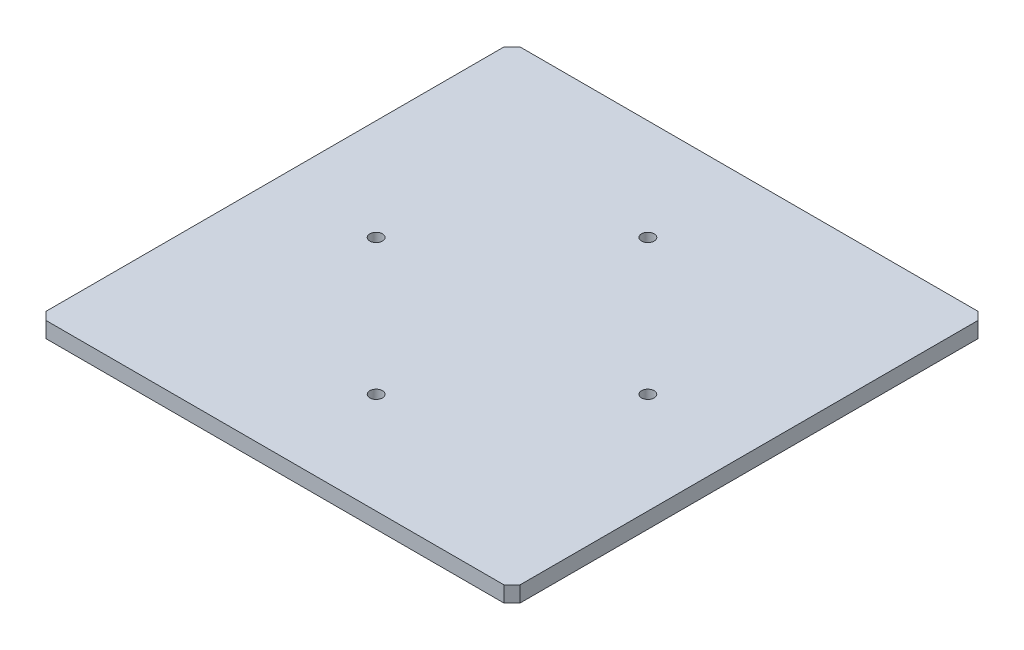
ISO-10303-21;
HEADER;
FILE_DESCRIPTION(('STEP AP214'),'2;1');
FILE_NAME('part.step','',(''),(''),'','','');
FILE_SCHEMA(('AUTOMOTIVE_DESIGN { 1 0 10303 214 1 1 1 1 }'));
ENDSEC;
DATA;
#1=APPLICATION_CONTEXT('core data for automotive mechanical design processes');
#2=APPLICATION_PROTOCOL_DEFINITION('international standard','automotive_design',2000,#1);
#3=PRODUCT_CONTEXT('',#1,'mechanical');
#4=PRODUCT('Part','Part','',(#3));
#5=PRODUCT_RELATED_PRODUCT_CATEGORY('part','',(#4));
#6=PRODUCT_DEFINITION_FORMATION('','',#4);
#7=PRODUCT_DEFINITION_CONTEXT('part definition',#1,'design');
#8=PRODUCT_DEFINITION('design','',#6,#7);
#9=PRODUCT_DEFINITION_SHAPE('','',#8);
#10=(LENGTH_UNIT() NAMED_UNIT(*) SI_UNIT(.MILLI.,.METRE.));
#11=(NAMED_UNIT(*) PLANE_ANGLE_UNIT() SI_UNIT($,.RADIAN.));
#12=(NAMED_UNIT(*) SI_UNIT($,.STERADIAN.) SOLID_ANGLE_UNIT());
#13=UNCERTAINTY_MEASURE_WITH_UNIT(LENGTH_MEASURE(1.E-05),#10,'distance_accuracy_value','');
#14=(GEOMETRIC_REPRESENTATION_CONTEXT(3) GLOBAL_UNCERTAINTY_ASSIGNED_CONTEXT((#13)) GLOBAL_UNIT_ASSIGNED_CONTEXT((#10,
#11,#12)) REPRESENTATION_CONTEXT('',''));
#15=CARTESIAN_POINT('',(0.,0.,0.));
#16=DIRECTION('',(0.,0.,1.));
#17=DIRECTION('',(1.,0.,0.));
#18=AXIS2_PLACEMENT_3D('',#15,#16,#17);
#19=CARTESIAN_POINT('',(150.,10.,150.));
#20=DIRECTION('',(-1.,0.,0.));
#21=DIRECTION('',(0.,0.,1.));
#22=AXIS2_PLACEMENT_3D('',#19,#20,#21);
#23=PLANE('',#22);
#24=DIRECTION('',(0.,0.,-1.));
#25=VECTOR('',#24,1.);
#26=CARTESIAN_POINT('',(150.,0.,150.));
#27=LINE('',#26,#25);
#28=CARTESIAN_POINT('',(150.,0.,145.));
#29=VERTEX_POINT('',#28);
#30=CARTESIAN_POINT('',(150.,0.,-145.));
#31=VERTEX_POINT('',#30);
#32=EDGE_CURVE('E138',#29,#31,#27,.T.);
#33=ORIENTED_EDGE('',*,*,#32,.T.);
#34=DIRECTION('',(0.,1.,0.));
#35=VECTOR('',#34,1.);
#36=CARTESIAN_POINT('',(150.,10.,-145.));
#37=LINE('',#36,#35);
#38=CARTESIAN_POINT('',(150.,10.,-145.));
#39=VERTEX_POINT('',#38);
#40=EDGE_CURVE('E160',#31,#39,#37,.T.);
#41=ORIENTED_EDGE('',*,*,#40,.T.);
#42=DIRECTION('',(0.,0.,-1.));
#43=VECTOR('',#42,1.);
#44=CARTESIAN_POINT('',(150.,10.,150.));
#45=LINE('',#44,#43);
#46=CARTESIAN_POINT('',(150.,10.,145.));
#47=VERTEX_POINT('',#46);
#48=EDGE_CURVE('E136',#47,#39,#45,.T.);
#49=ORIENTED_EDGE('',*,*,#48,.F.);
#50=DIRECTION('',(0.,-1.,0.));
#51=VECTOR('',#50,1.);
#52=CARTESIAN_POINT('',(150.,10.,145.));
#53=LINE('',#52,#51);
#54=EDGE_CURVE('E157',#47,#29,#53,.T.);
#55=ORIENTED_EDGE('',*,*,#54,.T.);
#56=EDGE_LOOP('',(#33,#41,#49,#55));
#57=FACE_BOUND('',#56,.T.);
#58=ADVANCED_FACE('F40',(#57),#23,.F.);
#59=CARTESIAN_POINT('',(-150.,10.,-150.));
#60=DIRECTION('',(0.,0.,1.));
#61=DIRECTION('',(1.,0.,0.));
#62=AXIS2_PLACEMENT_3D('',#59,#60,#61);
#63=PLANE('',#62);
#64=DIRECTION('',(-1.,0.,0.));
#65=VECTOR('',#64,1.);
#66=CARTESIAN_POINT('',(-150.,0.,-150.));
#67=LINE('',#66,#65);
#68=CARTESIAN_POINT('',(145.,0.,-150.));
#69=VERTEX_POINT('',#68);
#70=CARTESIAN_POINT('',(-145.,0.,-150.));
#71=VERTEX_POINT('',#70);
#72=EDGE_CURVE('E134',#69,#71,#67,.T.);
#73=ORIENTED_EDGE('',*,*,#72,.T.);
#74=DIRECTION('',(0.,1.,0.));
#75=VECTOR('',#74,1.);
#76=CARTESIAN_POINT('',(-145.,10.,-150.));
#77=LINE('',#76,#75);
#78=CARTESIAN_POINT('',(-145.,10.,-150.));
#79=VERTEX_POINT('',#78);
#80=EDGE_CURVE('E112',#71,#79,#77,.T.);
#81=ORIENTED_EDGE('',*,*,#80,.T.);
#82=DIRECTION('',(-1.,0.,0.));
#83=VECTOR('',#82,1.);
#84=CARTESIAN_POINT('',(-150.,10.,-150.));
#85=LINE('',#84,#83);
#86=CARTESIAN_POINT('',(145.,10.,-150.));
#87=VERTEX_POINT('',#86);
#88=EDGE_CURVE('E174',#87,#79,#85,.T.);
#89=ORIENTED_EDGE('',*,*,#88,.F.);
#90=DIRECTION('',(0.,-1.,0.));
#91=VECTOR('',#90,1.);
#92=CARTESIAN_POINT('',(145.,10.,-150.));
#93=LINE('',#92,#91);
#94=EDGE_CURVE('E117',#87,#69,#93,.T.);
#95=ORIENTED_EDGE('',*,*,#94,.T.);
#96=EDGE_LOOP('',(#73,#81,#89,#95));
#97=FACE_BOUND('',#96,.T.);
#98=ADVANCED_FACE('F179',(#97),#63,.F.);
#99=CARTESIAN_POINT('',(-150.,10.,150.));
#100=DIRECTION('',(1.,0.,0.));
#101=DIRECTION('',(0.,0.,-1.));
#102=AXIS2_PLACEMENT_3D('',#99,#100,#101);
#103=PLANE('',#102);
#104=DIRECTION('',(0.,0.,1.));
#105=VECTOR('',#104,1.);
#106=CARTESIAN_POINT('',(-150.,10.,150.));
#107=LINE('',#106,#105);
#108=CARTESIAN_POINT('',(-150.,10.,-145.));
#109=VERTEX_POINT('',#108);
#110=CARTESIAN_POINT('',(-150.,10.,145.));
#111=VERTEX_POINT('',#110);
#112=EDGE_CURVE('E126',#109,#111,#107,.T.);
#113=ORIENTED_EDGE('',*,*,#112,.F.);
#114=DIRECTION('',(0.,-1.,0.));
#115=VECTOR('',#114,1.);
#116=CARTESIAN_POINT('',(-150.,10.,-145.));
#117=LINE('',#116,#115);
#118=CARTESIAN_POINT('',(-150.,0.,-145.));
#119=VERTEX_POINT('',#118);
#120=EDGE_CURVE('E111',#109,#119,#117,.T.);
#121=ORIENTED_EDGE('',*,*,#120,.T.);
#122=DIRECTION('',(0.,0.,1.));
#123=VECTOR('',#122,1.);
#124=CARTESIAN_POINT('',(-150.,0.,150.));
#125=LINE('',#124,#123);
#126=CARTESIAN_POINT('',(-150.,0.,145.));
#127=VERTEX_POINT('',#126);
#128=EDGE_CURVE('E124',#119,#127,#125,.T.);
#129=ORIENTED_EDGE('',*,*,#128,.T.);
#130=DIRECTION('',(0.,1.,0.));
#131=VECTOR('',#130,1.);
#132=CARTESIAN_POINT('',(-150.,10.,145.));
#133=LINE('',#132,#131);
#134=EDGE_CURVE('E128',#127,#111,#133,.T.);
#135=ORIENTED_EDGE('',*,*,#134,.T.);
#136=EDGE_LOOP('',(#113,#121,#129,#135));
#137=FACE_BOUND('',#136,.T.);
#138=ADVANCED_FACE('F123',(#137),#103,.F.);
#139=CARTESIAN_POINT('',(-150.,10.,150.));
#140=DIRECTION('',(0.,0.,-1.));
#141=DIRECTION('',(-1.,0.,0.));
#142=AXIS2_PLACEMENT_3D('',#139,#140,#141);
#143=PLANE('',#142);
#144=DIRECTION('',(1.,0.,0.));
#145=VECTOR('',#144,1.);
#146=CARTESIAN_POINT('',(-150.,10.,150.));
#147=LINE('',#146,#145);
#148=CARTESIAN_POINT('',(-145.,10.,150.));
#149=VERTEX_POINT('',#148);
#150=CARTESIAN_POINT('',(145.,10.,150.));
#151=VERTEX_POINT('',#150);
#152=EDGE_CURVE('E142',#149,#151,#147,.T.);
#153=ORIENTED_EDGE('',*,*,#152,.F.);
#154=DIRECTION('',(0.,-1.,0.));
#155=VECTOR('',#154,1.);
#156=CARTESIAN_POINT('',(-145.,10.,150.));
#157=LINE('',#156,#155);
#158=CARTESIAN_POINT('',(-145.,0.,150.));
#159=VERTEX_POINT('',#158);
#160=EDGE_CURVE('E11',#149,#159,#157,.T.);
#161=ORIENTED_EDGE('',*,*,#160,.T.);
#162=DIRECTION('',(1.,0.,0.));
#163=VECTOR('',#162,1.);
#164=CARTESIAN_POINT('',(-150.,0.,150.));
#165=LINE('',#164,#163);
#166=CARTESIAN_POINT('',(145.,0.,150.));
#167=VERTEX_POINT('',#166);
#168=EDGE_CURVE('E133',#159,#167,#165,.T.);
#169=ORIENTED_EDGE('',*,*,#168,.T.);
#170=DIRECTION('',(0.,1.,0.));
#171=VECTOR('',#170,1.);
#172=CARTESIAN_POINT('',(145.,10.,150.));
#173=LINE('',#172,#171);
#174=EDGE_CURVE('E49',#167,#151,#173,.T.);
#175=ORIENTED_EDGE('',*,*,#174,.T.);
#176=EDGE_LOOP('',(#153,#161,#169,#175));
#177=FACE_BOUND('',#176,.T.);
#178=ADVANCED_FACE('F213',(#177),#143,.F.);
#179=CARTESIAN_POINT('',(0.,10.,0.));
#180=DIRECTION('',(0.,-1.,0.));
#181=DIRECTION('',(0.,0.,-1.));
#182=AXIS2_PLACEMENT_3D('',#179,#180,#181);
#183=PLANE('',#182);
#184=CARTESIAN_POINT('',(0.,10.,86.));
#185=DIRECTION('',(0.,1.,0.));
#186=DIRECTION('',(0.,0.,1.));
#187=AXIS2_PLACEMENT_3D('',#184,#185,#186);
#188=CIRCLE('',#187,4.);
#189=CARTESIAN_POINT('',(0.,10.,90.));
#190=VERTEX_POINT('',#189);
#191=EDGE_CURVE('E182',#190,#190,#188,.T.);
#192=ORIENTED_EDGE('',*,*,#191,.F.);
#193=EDGE_LOOP('',(#192));
#194=FACE_BOUND('',#193,.T.);
#195=CARTESIAN_POINT('',(-86.,10.,0.));
#196=DIRECTION('',(0.,1.,0.));
#197=DIRECTION('',(0.,0.,1.));
#198=AXIS2_PLACEMENT_3D('',#195,#196,#197);
#199=CIRCLE('',#198,4.00000000000001);
#200=CARTESIAN_POINT('',(-86.,10.,4.00000000000001));
#201=VERTEX_POINT('',#200);
#202=EDGE_CURVE('E200',#201,#201,#199,.T.);
#203=ORIENTED_EDGE('',*,*,#202,.F.);
#204=EDGE_LOOP('',(#203));
#205=FACE_BOUND('',#204,.T.);
#206=CARTESIAN_POINT('',(0.,10.,-86.));
#207=DIRECTION('',(0.,1.,0.));
#208=DIRECTION('',(0.,0.,1.));
#209=AXIS2_PLACEMENT_3D('',#206,#207,#208);
#210=CIRCLE('',#209,4.);
#211=CARTESIAN_POINT('',(0.,10.,-82.));
#212=VERTEX_POINT('',#211);
#213=EDGE_CURVE('E194',#212,#212,#210,.T.);
#214=ORIENTED_EDGE('',*,*,#213,.F.);
#215=EDGE_LOOP('',(#214));
#216=FACE_BOUND('',#215,.T.);
#217=CARTESIAN_POINT('',(86.,10.,0.));
#218=DIRECTION('',(0.,1.,0.));
#219=DIRECTION('',(0.,0.,1.));
#220=AXIS2_PLACEMENT_3D('',#217,#218,#219);
#221=CIRCLE('',#220,4.00000000000001);
#222=CARTESIAN_POINT('',(86.,10.,3.99999999999999));
#223=VERTEX_POINT('',#222);
#224=EDGE_CURVE('E188',#223,#223,#221,.T.);
#225=ORIENTED_EDGE('',*,*,#224,.F.);
#226=EDGE_LOOP('',(#225));
#227=FACE_BOUND('',#226,.T.);
#228=ORIENTED_EDGE('',*,*,#88,.T.);
#229=DIRECTION('',(0.707106781186548,0.,-0.707106781186548));
#230=VECTOR('',#229,1.);
#231=CARTESIAN_POINT('',(-150.,10.,-145.));
#232=LINE('',#231,#230);
#233=EDGE_CURVE('E155',#79,#109,#232,.F.);
#234=ORIENTED_EDGE('',*,*,#233,.T.);
#235=ORIENTED_EDGE('',*,*,#112,.T.);
#236=DIRECTION('',(-0.707106781186548,0.,-0.707106781186548));
#237=VECTOR('',#236,1.);
#238=CARTESIAN_POINT('',(-145.,10.,150.));
#239=LINE('',#238,#237);
#240=EDGE_CURVE('E62',#111,#149,#239,.F.);
#241=ORIENTED_EDGE('',*,*,#240,.T.);
#242=ORIENTED_EDGE('',*,*,#152,.T.);
#243=DIRECTION('',(-0.707106781186548,0.,0.707106781186548));
#244=VECTOR('',#243,1.);
#245=CARTESIAN_POINT('',(150.,10.,145.));
#246=LINE('',#245,#244);
#247=EDGE_CURVE('E150',#151,#47,#246,.F.);
#248=ORIENTED_EDGE('',*,*,#247,.T.);
#249=ORIENTED_EDGE('',*,*,#48,.T.);
#250=DIRECTION('',(0.707106781186548,0.,0.707106781186548));
#251=VECTOR('',#250,1.);
#252=CARTESIAN_POINT('',(145.,10.,-150.));
#253=LINE('',#252,#251);
#254=EDGE_CURVE('E153',#39,#87,#253,.F.);
#255=ORIENTED_EDGE('',*,*,#254,.T.);
#256=EDGE_LOOP('',(#228,#234,#235,#241,#242,#248,#249,#255));
#257=FACE_BOUND('',#256,.T.);
#258=ADVANCED_FACE('F171',(#194,#205,#216,#227,#257),#183,.F.);
#259=CARTESIAN_POINT('',(0.,0.,0.));
#260=DIRECTION('',(0.,-1.,0.));
#261=DIRECTION('',(0.,0.,-1.));
#262=AXIS2_PLACEMENT_3D('',#259,#260,#261);
#263=PLANE('',#262);
#264=CARTESIAN_POINT('',(0.,0.,86.));
#265=DIRECTION('',(0.,1.,0.));
#266=DIRECTION('',(0.,0.,1.));
#267=AXIS2_PLACEMENT_3D('',#264,#265,#266);
#268=CIRCLE('',#267,4.);
#269=CARTESIAN_POINT('',(0.,0.,90.));
#270=VERTEX_POINT('',#269);
#271=EDGE_CURVE('E180',#270,#270,#268,.T.);
#272=ORIENTED_EDGE('',*,*,#271,.T.);
#273=EDGE_LOOP('',(#272));
#274=FACE_BOUND('',#273,.T.);
#275=CARTESIAN_POINT('',(-86.,0.,0.));
#276=DIRECTION('',(0.,1.,0.));
#277=DIRECTION('',(0.,0.,1.));
#278=AXIS2_PLACEMENT_3D('',#275,#276,#277);
#279=CIRCLE('',#278,4.00000000000001);
#280=CARTESIAN_POINT('',(-86.,0.,4.00000000000001));
#281=VERTEX_POINT('',#280);
#282=EDGE_CURVE('E203',#281,#281,#279,.T.);
#283=ORIENTED_EDGE('',*,*,#282,.T.);
#284=EDGE_LOOP('',(#283));
#285=FACE_BOUND('',#284,.T.);
#286=CARTESIAN_POINT('',(0.,0.,-86.));
#287=DIRECTION('',(0.,1.,0.));
#288=DIRECTION('',(0.,0.,1.));
#289=AXIS2_PLACEMENT_3D('',#286,#287,#288);
#290=CIRCLE('',#289,4.);
#291=CARTESIAN_POINT('',(0.,0.,-82.));
#292=VERTEX_POINT('',#291);
#293=EDGE_CURVE('E197',#292,#292,#290,.T.);
#294=ORIENTED_EDGE('',*,*,#293,.T.);
#295=EDGE_LOOP('',(#294));
#296=FACE_BOUND('',#295,.T.);
#297=CARTESIAN_POINT('',(86.,0.,0.));
#298=DIRECTION('',(0.,1.,0.));
#299=DIRECTION('',(0.,0.,1.));
#300=AXIS2_PLACEMENT_3D('',#297,#298,#299);
#301=CIRCLE('',#300,4.00000000000001);
#302=CARTESIAN_POINT('',(86.,0.,3.99999999999999));
#303=VERTEX_POINT('',#302);
#304=EDGE_CURVE('E191',#303,#303,#301,.T.);
#305=ORIENTED_EDGE('',*,*,#304,.T.);
#306=EDGE_LOOP('',(#305));
#307=FACE_BOUND('',#306,.T.);
#308=ORIENTED_EDGE('',*,*,#128,.F.);
#309=DIRECTION('',(-0.707106781186548,0.,0.707106781186548));
#310=VECTOR('',#309,1.);
#311=CARTESIAN_POINT('',(-147.5,0.,-147.5));
#312=LINE('',#311,#310);
#313=EDGE_CURVE('E107',#119,#71,#312,.F.);
#314=ORIENTED_EDGE('',*,*,#313,.T.);
#315=ORIENTED_EDGE('',*,*,#72,.F.);
#316=DIRECTION('',(-0.707106781186548,0.,-0.707106781186548));
#317=VECTOR('',#316,1.);
#318=CARTESIAN_POINT('',(147.5,0.,-147.5));
#319=LINE('',#318,#317);
#320=EDGE_CURVE('E118',#69,#31,#319,.F.);
#321=ORIENTED_EDGE('',*,*,#320,.T.);
#322=ORIENTED_EDGE('',*,*,#32,.F.);
#323=DIRECTION('',(0.707106781186548,0.,-0.707106781186548));
#324=VECTOR('',#323,1.);
#325=CARTESIAN_POINT('',(147.5,0.,147.5));
#326=LINE('',#325,#324);
#327=EDGE_CURVE('E127',#29,#167,#326,.F.);
#328=ORIENTED_EDGE('',*,*,#327,.T.);
#329=ORIENTED_EDGE('',*,*,#168,.F.);
#330=DIRECTION('',(0.707106781186548,0.,0.707106781186548));
#331=VECTOR('',#330,1.);
#332=CARTESIAN_POINT('',(-147.5,0.,147.5));
#333=LINE('',#332,#331);
#334=EDGE_CURVE('E132',#159,#127,#333,.F.);
#335=ORIENTED_EDGE('',*,*,#334,.T.);
#336=EDGE_LOOP('',(#308,#314,#315,#321,#322,#328,#329,#335));
#337=FACE_BOUND('',#336,.T.);
#338=ADVANCED_FACE('F130',(#274,#285,#296,#307,#337),#263,.T.);
#339=CARTESIAN_POINT('',(-150.,10.,-145.));
#340=DIRECTION('',(0.707106781186547,0.,0.707106781186547));
#341=DIRECTION('',(0.,-1.,0.));
#342=AXIS2_PLACEMENT_3D('',#339,#340,#341);
#343=PLANE('',#342);
#344=ORIENTED_EDGE('',*,*,#233,.F.);
#345=ORIENTED_EDGE('',*,*,#80,.F.);
#346=ORIENTED_EDGE('',*,*,#313,.F.);
#347=ORIENTED_EDGE('',*,*,#120,.F.);
#348=EDGE_LOOP('',(#344,#345,#346,#347));
#349=FACE_BOUND('',#348,.T.);
#350=ADVANCED_FACE('F110',(#349),#343,.F.);
#351=CARTESIAN_POINT('',(145.,10.,-150.));
#352=DIRECTION('',(-0.707106781186547,0.,0.707106781186547));
#353=DIRECTION('',(0.,-1.,0.));
#354=AXIS2_PLACEMENT_3D('',#351,#352,#353);
#355=PLANE('',#354);
#356=ORIENTED_EDGE('',*,*,#254,.F.);
#357=ORIENTED_EDGE('',*,*,#40,.F.);
#358=ORIENTED_EDGE('',*,*,#320,.F.);
#359=ORIENTED_EDGE('',*,*,#94,.F.);
#360=EDGE_LOOP('',(#356,#357,#358,#359));
#361=FACE_BOUND('',#360,.T.);
#362=ADVANCED_FACE('F177',(#361),#355,.F.);
#363=CARTESIAN_POINT('',(-145.,10.,150.));
#364=DIRECTION('',(0.707106781186547,0.,-0.707106781186547));
#365=DIRECTION('',(0.,-1.,0.));
#366=AXIS2_PLACEMENT_3D('',#363,#364,#365);
#367=PLANE('',#366);
#368=ORIENTED_EDGE('',*,*,#240,.F.);
#369=ORIENTED_EDGE('',*,*,#134,.F.);
#370=ORIENTED_EDGE('',*,*,#334,.F.);
#371=ORIENTED_EDGE('',*,*,#160,.F.);
#372=EDGE_LOOP('',(#368,#369,#370,#371));
#373=FACE_BOUND('',#372,.T.);
#374=ADVANCED_FACE('F233',(#373),#367,.F.);
#375=CARTESIAN_POINT('',(150.,10.,145.));
#376=DIRECTION('',(-0.707106781186547,0.,-0.707106781186547));
#377=DIRECTION('',(0.,-1.,0.));
#378=AXIS2_PLACEMENT_3D('',#375,#376,#377);
#379=PLANE('',#378);
#380=ORIENTED_EDGE('',*,*,#247,.F.);
#381=ORIENTED_EDGE('',*,*,#174,.F.);
#382=ORIENTED_EDGE('',*,*,#327,.F.);
#383=ORIENTED_EDGE('',*,*,#54,.F.);
#384=EDGE_LOOP('',(#380,#381,#382,#383));
#385=FACE_BOUND('',#384,.T.);
#386=ADVANCED_FACE('F43',(#385),#379,.F.);
#387=CARTESIAN_POINT('',(86.,0.,0.));
#388=DIRECTION('',(0.,1.,0.));
#389=DIRECTION('',(0.,0.,1.));
#390=AXIS2_PLACEMENT_3D('',#387,#388,#389);
#391=CYLINDRICAL_SURFACE('',#390,4.00000000000001);
#392=ORIENTED_EDGE('',*,*,#304,.F.);
#393=EDGE_LOOP('',(#392));
#394=FACE_BOUND('',#393,.T.);
#395=ORIENTED_EDGE('',*,*,#224,.T.);
#396=EDGE_LOOP('',(#395));
#397=FACE_BOUND('',#396,.T.);
#398=ADVANCED_FACE('F221',(#394,#397),#391,.F.);
#399=CARTESIAN_POINT('',(0.,0.,-86.));
#400=DIRECTION('',(0.,1.,0.));
#401=DIRECTION('',(0.,0.,1.));
#402=AXIS2_PLACEMENT_3D('',#399,#400,#401);
#403=CYLINDRICAL_SURFACE('',#402,4.);
#404=ORIENTED_EDGE('',*,*,#293,.F.);
#405=EDGE_LOOP('',(#404));
#406=FACE_BOUND('',#405,.T.);
#407=ORIENTED_EDGE('',*,*,#213,.T.);
#408=EDGE_LOOP('',(#407));
#409=FACE_BOUND('',#408,.T.);
#410=ADVANCED_FACE('F223',(#406,#409),#403,.F.);
#411=CARTESIAN_POINT('',(-86.,0.,0.));
#412=DIRECTION('',(0.,1.,0.));
#413=DIRECTION('',(0.,0.,1.));
#414=AXIS2_PLACEMENT_3D('',#411,#412,#413);
#415=CYLINDRICAL_SURFACE('',#414,4.00000000000001);
#416=ORIENTED_EDGE('',*,*,#282,.F.);
#417=EDGE_LOOP('',(#416));
#418=FACE_BOUND('',#417,.T.);
#419=ORIENTED_EDGE('',*,*,#202,.T.);
#420=EDGE_LOOP('',(#419));
#421=FACE_BOUND('',#420,.T.);
#422=ADVANCED_FACE('F230',(#418,#421),#415,.F.);
#423=CARTESIAN_POINT('',(0.,0.,86.));
#424=DIRECTION('',(0.,1.,0.));
#425=DIRECTION('',(0.,0.,1.));
#426=AXIS2_PLACEMENT_3D('',#423,#424,#425);
#427=CYLINDRICAL_SURFACE('',#426,4.);
#428=ORIENTED_EDGE('',*,*,#271,.F.);
#429=EDGE_LOOP('',(#428));
#430=FACE_BOUND('',#429,.T.);
#431=ORIENTED_EDGE('',*,*,#191,.T.);
#432=EDGE_LOOP('',(#431));
#433=FACE_BOUND('',#432,.T.);
#434=ADVANCED_FACE('F209',(#430,#433),#427,.F.);
#435=CLOSED_SHELL('',(#58,#98,#138,#178,#258,#338,#350,#362,#374,#386,#398,#410,#422,#434));
#436=MANIFOLD_SOLID_BREP('B2',#435);
#437=ADVANCED_BREP_SHAPE_REPRESENTATION('',(#18,#436),#14);
#438=SHAPE_DEFINITION_REPRESENTATION(#9,#437);
ENDSEC;
END-ISO-10303-21;
